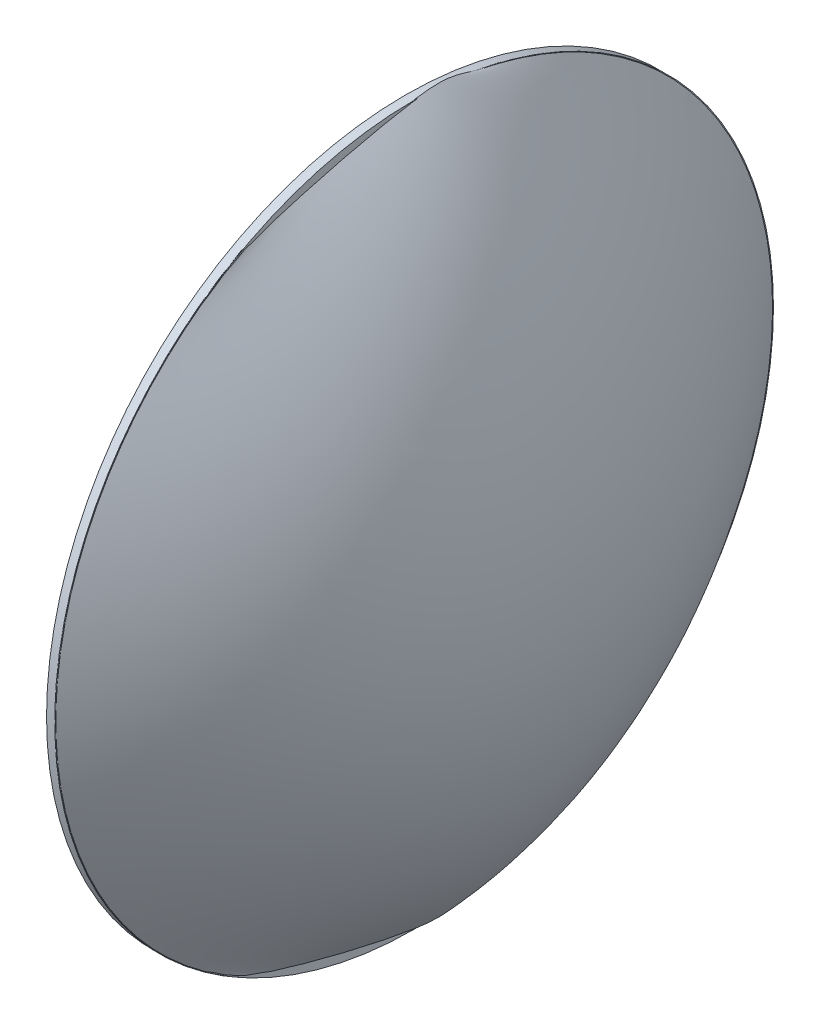
ISO-10303-21;
HEADER;
FILE_DESCRIPTION(('STEP AP214'),'2;1');
FILE_NAME('part.step','',(''),(''),'','','');
FILE_SCHEMA(('AUTOMOTIVE_DESIGN { 1 0 10303 214 1 1 1 1 }'));
ENDSEC;
DATA;
#1=APPLICATION_CONTEXT('core data for automotive mechanical design processes');
#2=APPLICATION_PROTOCOL_DEFINITION('international standard','automotive_design',2000,#1);
#3=PRODUCT_CONTEXT('',#1,'mechanical');
#4=PRODUCT('Part','Part','',(#3));
#5=PRODUCT_RELATED_PRODUCT_CATEGORY('part','',(#4));
#6=PRODUCT_DEFINITION_FORMATION('','',#4);
#7=PRODUCT_DEFINITION_CONTEXT('part definition',#1,'design');
#8=PRODUCT_DEFINITION('design','',#6,#7);
#9=PRODUCT_DEFINITION_SHAPE('','',#8);
#10=(LENGTH_UNIT() NAMED_UNIT(*) SI_UNIT(.MILLI.,.METRE.));
#11=(NAMED_UNIT(*) PLANE_ANGLE_UNIT() SI_UNIT($,.RADIAN.));
#12=(NAMED_UNIT(*) SI_UNIT($,.STERADIAN.) SOLID_ANGLE_UNIT());
#13=UNCERTAINTY_MEASURE_WITH_UNIT(LENGTH_MEASURE(1.E-05),#10,'distance_accuracy_value','');
#14=(GEOMETRIC_REPRESENTATION_CONTEXT(3) GLOBAL_UNCERTAINTY_ASSIGNED_CONTEXT((#13)) GLOBAL_UNIT_ASSIGNED_CONTEXT((#10,
#11,#12)) REPRESENTATION_CONTEXT('',''));
#15=CARTESIAN_POINT('',(0.,0.,0.));
#16=DIRECTION('',(0.,0.,1.));
#17=DIRECTION('',(1.,0.,0.));
#18=AXIS2_PLACEMENT_3D('',#15,#16,#17);
#19=CARTESIAN_POINT('',(5.05819278737862,12.3155775488069,-2.77582999720327));
#20=CARTESIAN_POINT('',(5.05819278737862,12.5513355717501,-2.03455000515564));
#21=CARTESIAN_POINT('',(5.05819278737863,12.8019065707928,-1.35369603384233));
#22=CARTESIAN_POINT('',(5.05819278737863,11.6556226490375,3.38241528943696));
#23=CARTESIAN_POINT('',(5.05819278737862,10.972008164738,5.34961794468563));
#24=CARTESIAN_POINT('',(5.05819278737862,12.1909921607769,-3.49372776593349));
#25=CARTESIAN_POINT('',(5.29928948159911,12.2749691544231,-2.52552998061758));
#26=CARTESIAN_POINT('',(5.56620600117032,12.2568156964552,-1.17109363359682));
#27=CARTESIAN_POINT('',(5.29928948159911,11.2783108464397,3.70213535397704));
#28=CARTESIAN_POINT('',(5.05819278737862,10.7047322717769,5.83936171325839));
#29=CARTESIAN_POINT('',(5.05819278737862,11.8156387321061,-4.9074715129215));
#30=CARTESIAN_POINT('',(5.78148287004008,11.5960536671584,-3.48543814106903));
#31=CARTESIAN_POINT('',(6.50429533061974,11.2045497443249,-0.805504169071557));
#32=CARTESIAN_POINT('',(5.78148287004008,10.4577633461603,4.30557097667063));
#33=CARTESIAN_POINT('',(5.05819278737862,10.1042565907709,6.78284474401733));
#34=CARTESIAN_POINT('',(5.05819278737862,10.5862056563845,-7.56246427816641));
#35=CARTESIAN_POINT('',(6.60933604258117,10.0006820747642,-5.27404460383994));
#36=CARTESIAN_POINT('',(8.18724550268375,9.04799376239242,-0.124849742357353));
#37=CARTESIAN_POINT('',(6.60933604258117,8.71716740829643,5.43135033005946));
#38=CARTESIAN_POINT('',(5.05819278737863,8.66321180992265,8.49343226643619));
#39=CARTESIAN_POINT('',(5.05819278737862,8.21350108134718,-10.4004550800361));
#40=CARTESIAN_POINT('',(7.43436932643087,7.49024081042976,-7.16442798617025));
#41=CARTESIAN_POINT('',(9.84050412670252,6.36953504309144,0.604701657512637));
#42=CARTESIAN_POINT('',(7.43436932643087,6.31907662708066,6.59556282796433));
#43=CARTESIAN_POINT('',(5.05819278737863,6.45598472635514,10.2402809457378));
#44=CARTESIAN_POINT('',(5.05819278737862,4.37109236655647,-12.6238337853541));
#45=CARTESIAN_POINT('',(8.0385807672631,3.90020346971298,-8.63321170518301));
#46=CARTESIAN_POINT('',(11.0596449752799,3.17403283196431,1.17551117067543));
#47=CARTESIAN_POINT('',(8.0385807672631,3.21746822656638,7.49013300950126));
#48=CARTESIAN_POINT('',(5.05819278737862,3.34718202182867,11.5609690567946));
#49=CARTESIAN_POINT('',(5.05819278737862,-0.000340070187399472,-13.3962527483643));
#50=CARTESIAN_POINT('',(8.24271338365613,-0.000340070187390755,-9.14142464673477));
#51=CARTESIAN_POINT('',(11.4697940350695,-0.000340070187372725,1.37396548187094));
#52=CARTESIAN_POINT('',(8.24271338365613,-0.000340070187372719,7.79727067207013));
#53=CARTESIAN_POINT('',(5.05819278737863,-0.000340070187374535,12.0118973447819));
#54=CARTESIAN_POINT('',(5.05819278737862,-4.37177250693124,-12.6238337853541));
#55=CARTESIAN_POINT('',(8.0385807672631,-3.90088361008774,-8.63321170518302));
#56=CARTESIAN_POINT('',(11.0596449752799,-3.17471297233906,1.17551117067543));
#57=CARTESIAN_POINT('',(8.03858076726311,-3.21814836694114,7.49013300950128));
#58=CARTESIAN_POINT('',(5.05819278737862,-3.34786216220344,11.5609690567946));
#59=CARTESIAN_POINT('',(5.05819278737862,-8.21418122172198,-10.400455080036));
#60=CARTESIAN_POINT('',(7.43436932643088,-7.49092095080453,-7.16442798617023));
#61=CARTESIAN_POINT('',(9.84050412670254,-6.37021518346619,0.604701657512632));
#62=CARTESIAN_POINT('',(7.43436932643088,-6.31975676745541,6.59556282796431));
#63=CARTESIAN_POINT('',(5.05819278737862,-6.45666486672991,10.2402809457378));
#64=CARTESIAN_POINT('',(5.05819278737862,-10.5868857967593,-7.56246427816644));
#65=CARTESIAN_POINT('',(6.60933604258117,-10.001362215139,-5.27404460383995));
#66=CARTESIAN_POINT('',(8.18724550268376,-9.0486739027672,-0.124849742357352));
#67=CARTESIAN_POINT('',(6.60933604258117,-8.71784754867119,5.43135033005949));
#68=CARTESIAN_POINT('',(5.05819278737863,-8.6638919502974,8.49343226643621));
#69=CARTESIAN_POINT('',(5.05819278737862,-11.8163188724809,-4.90747151292149));
#70=CARTESIAN_POINT('',(5.78148287004008,-11.5967338075332,-3.48543814106902));
#71=CARTESIAN_POINT('',(6.50429533061975,-11.2052298846996,-0.805504169071569));
#72=CARTESIAN_POINT('',(5.78148287004008,-10.4584434865351,4.30557097667065));
#73=CARTESIAN_POINT('',(5.05819278737862,-10.1049367311457,6.78284474401735));
#74=CARTESIAN_POINT('',(5.05819278737862,-12.1916723011517,-3.49372776593349));
#75=CARTESIAN_POINT('',(5.29928948159911,-12.2756492947979,-2.52552998061758));
#76=CARTESIAN_POINT('',(5.56620600117033,-12.25749583683,-1.17109363359683));
#77=CARTESIAN_POINT('',(5.29928948159911,-11.2789909868145,3.70213535397705));
#78=CARTESIAN_POINT('',(5.05819278737862,-10.7054124121517,5.8393617132584));
#79=CARTESIAN_POINT('',(5.05819278737862,-12.3162576891817,-2.77582999720327));
#80=CARTESIAN_POINT('',(5.05819278737863,-12.5520157121249,-2.03455000515564));
#81=CARTESIAN_POINT('',(5.05819278737864,-12.8025867111676,-1.35369603384233));
#82=CARTESIAN_POINT('',(5.05819278737863,-11.6563027894123,3.38241528943697));
#83=CARTESIAN_POINT('',(5.05819278737862,-10.9726883051127,5.34961794468564));
#84=B_SPLINE_SURFACE_WITH_KNOTS('',3,3,((#19,#20,#21,#22,#23),(#24,#25,#26,#27,#28),(#29,#30,
#31,#32,#33),(#34,#35,#36,#37,#38),(#39,#40,#41,#42,#43),(#44,#45,#46,#47,#48),(#49,#50,#51,#52,
#53),(#54,#55,#56,#57,#58),(#59,#60,#61,#62,#63),(#64,#65,#66,#67,#68),(#69,#70,#71,#72,#73),
(#74,#75,#76,#77,#78),(#79,#80,#81,#82,#83)),.UNSPECIFIED.,.F.,.F.,.F.,(4,1,1,1,1,1,1,1,1,1,4),
(4,1,4),(0.,0.0625,0.125,0.25,0.375,0.5,0.625,0.75,0.875,0.9375,1.),(0.,0.442388494157825,1.),.UNSPECIFIED.);
#85=CARTESIAN_POINT('',(5.05819278737862,12.3155775488069,-2.77582999720327));
#86=CARTESIAN_POINT('',(5.05819278737862,12.1909921607769,-3.49372776593349));
#87=CARTESIAN_POINT('',(5.05819278737862,11.8156387321061,-4.9074715129215));
#88=CARTESIAN_POINT('',(5.05819278737862,10.5862056563845,-7.56246427816641));
#89=CARTESIAN_POINT('',(5.05819278737862,8.21350108134718,-10.4004550800361));
#90=CARTESIAN_POINT('',(5.05819278737862,4.37109236655647,-12.6238337853541));
#91=CARTESIAN_POINT('',(5.05819278737862,-0.000340070187399472,-13.3962527483643));
#92=CARTESIAN_POINT('',(5.05819278737862,-4.37177250693124,-12.6238337853541));
#93=CARTESIAN_POINT('',(5.05819278737862,-8.21418122172198,-10.400455080036));
#94=CARTESIAN_POINT('',(5.05819278737862,-10.5868857967593,-7.56246427816644));
#95=CARTESIAN_POINT('',(5.05819278737862,-11.8163188724809,-4.90747151292149));
#96=CARTESIAN_POINT('',(5.05819278737862,-12.1916723011517,-3.49372776593349));
#97=CARTESIAN_POINT('',(5.05819278737862,-12.3162576891817,-2.77582999720327));
#98=B_SPLINE_CURVE_WITH_KNOTS('',3,(#85,#86,#87,#88,#89,#90,#91,#92,#93,#94,#95,#96,#97),
.UNSPECIFIED.,.F.,.F.,(4,1,1,1,1,1,1,1,1,1,4),(0.,0.0625,0.125,0.25,0.375,0.5,0.625,0.75,0.875,
0.9375,1.),.UNSPECIFIED.);
#99=CARTESIAN_POINT('',(5.05819278737862,12.3155775488069,-2.77582999720327));
#100=VERTEX_POINT('',#99);
#101=CARTESIAN_POINT('',(5.05819278737862,-12.3162576891817,-2.77582999720327));
#102=VERTEX_POINT('',#101);
#103=EDGE_CURVE('E14',#100,#102,#98,.T.);
#104=CARTESIAN_POINT('',(5.05819278737862,-12.3162576891817,-2.77582999720327));
#105=CARTESIAN_POINT('',(5.05819278737863,-12.5520157121249,-2.03455000515564));
#106=CARTESIAN_POINT('',(5.05819278737864,-12.8025867111676,-1.35369603384233));
#107=CARTESIAN_POINT('',(5.05819278737863,-11.6563027894123,3.38241528943697));
#108=CARTESIAN_POINT('',(5.05819278737862,-10.9726883051127,5.34961794468564));
#109=B_SPLINE_CURVE_WITH_KNOTS('',3,(#104,#105,#106,#107,#108),.UNSPECIFIED.,.F.,.F.,(4,1,4),
(0.,0.442388494157825,1.),.UNSPECIFIED.);
#110=CARTESIAN_POINT('',(5.05819278737862,-10.9726883051127,5.34961794468564));
#111=VERTEX_POINT('',#110);
#112=EDGE_CURVE('E83',#102,#111,#109,.T.);
#113=CARTESIAN_POINT('',(5.05819278737862,10.972008164738,5.34961794468563));
#114=CARTESIAN_POINT('',(5.05819278737862,10.7047322717769,5.83936171325839));
#115=CARTESIAN_POINT('',(5.05819278737862,10.1042565907709,6.78284474401733));
#116=CARTESIAN_POINT('',(5.05819278737863,8.66321180992265,8.49343226643619));
#117=CARTESIAN_POINT('',(5.05819278737863,6.45598472635514,10.2402809457378));
#118=CARTESIAN_POINT('',(5.05819278737862,3.34718202182867,11.5609690567946));
#119=CARTESIAN_POINT('',(5.05819278737863,-0.000340070187374535,12.0118973447819));
#120=CARTESIAN_POINT('',(5.05819278737862,-3.34786216220344,11.5609690567946));
#121=CARTESIAN_POINT('',(5.05819278737862,-6.45666486672991,10.2402809457378));
#122=CARTESIAN_POINT('',(5.05819278737863,-8.6638919502974,8.49343226643621));
#123=CARTESIAN_POINT('',(5.05819278737862,-10.1049367311457,6.78284474401735));
#124=CARTESIAN_POINT('',(5.05819278737862,-10.7054124121517,5.8393617132584));
#125=CARTESIAN_POINT('',(5.05819278737862,-10.9726883051127,5.34961794468564));
#126=B_SPLINE_CURVE_WITH_KNOTS('',3,(#113,#114,#115,#116,#117,#118,#119,#120,#121,#122,#123,
#124,#125),.UNSPECIFIED.,.F.,.F.,(4,1,1,1,1,1,1,1,1,1,4),(0.,0.0625,0.125,0.25,0.375,0.5,0.625,
0.75,0.875,0.9375,1.),.UNSPECIFIED.);
#127=CARTESIAN_POINT('',(5.05819278737862,10.972008164738,5.34961794468563));
#128=VERTEX_POINT('',#127);
#129=EDGE_CURVE('E99',#111,#128,#126,.F.);
#130=CARTESIAN_POINT('',(5.05819278737862,12.3155775488069,-2.77582999720327));
#131=CARTESIAN_POINT('',(5.05819278737862,12.5513355717501,-2.03455000515564));
#132=CARTESIAN_POINT('',(5.05819278737863,12.8019065707928,-1.35369603384233));
#133=CARTESIAN_POINT('',(5.05819278737863,11.6556226490375,3.38241528943696));
#134=CARTESIAN_POINT('',(5.05819278737862,10.972008164738,5.34961794468563));
#135=B_SPLINE_CURVE_WITH_KNOTS('',3,(#130,#131,#132,#133,#134),.UNSPECIFIED.,.F.,.F.,(4,1,4),
(0.,0.442388494157825,1.),.UNSPECIFIED.);
#136=EDGE_CURVE('E103',#128,#100,#135,.F.);
#137=ORIENTED_EDGE('',*,*,#103,.T.);
#138=ORIENTED_EDGE('',*,*,#112,.T.);
#139=ORIENTED_EDGE('',*,*,#129,.T.);
#140=ORIENTED_EDGE('',*,*,#136,.T.);
#141=EDGE_LOOP('',(#137,#138,#139,#140));
#142=FACE_BOUND('',#141,.T.);
#143=ADVANCED_FACE('F80',(#142),#84,.T.);
#144=OPEN_SHELL('',(#143));
#145=SHELL_BASED_SURFACE_MODEL('B2',(#144));
#146=CARTESIAN_POINT('',(5.07360834674977,0.,-0.649890601008446));
#147=DIRECTION('',(-1.,0.,0.));
#148=DIRECTION('',(0.,0.,1.));
#149=AXIS2_PLACEMENT_3D('',#146,#147,#148);
#150=CYLINDRICAL_SURFACE('',#149,12.5);
#151=CARTESIAN_POINT('',(5.07360834674977,0.,-0.649890601008446));
#152=DIRECTION('',(1.,0.,0.));
#153=DIRECTION('',(0.,0.,-1.));
#154=AXIS2_PLACEMENT_3D('',#151,#152,#153);
#155=CIRCLE('',#154,12.5);
#156=CARTESIAN_POINT('',(5.07360834674977,0.,-13.1498906010084));
#157=VERTEX_POINT('',#156);
#158=EDGE_CURVE('E79',#157,#157,#155,.T.);
#159=ORIENTED_EDGE('',*,*,#158,.F.);
#160=EDGE_LOOP('',(#159));
#161=FACE_BOUND('',#160,.T.);
#162=CARTESIAN_POINT('',(4.76110834674977,0.,-0.649890601008446));
#163=DIRECTION('',(1.,0.,0.));
#164=DIRECTION('',(0.,0.,-1.));
#165=AXIS2_PLACEMENT_3D('',#162,#163,#164);
#166=CIRCLE('',#165,12.5);
#167=CARTESIAN_POINT('',(4.76110834674977,0.,-13.1498906010084));
#168=VERTEX_POINT('',#167);
#169=EDGE_CURVE('E159',#168,#168,#166,.T.);
#170=ORIENTED_EDGE('',*,*,#169,.T.);
#171=EDGE_LOOP('',(#170));
#172=FACE_BOUND('',#171,.T.);
#173=ADVANCED_FACE('F156',(#161,#172),#150,.T.);
#174=CARTESIAN_POINT('',(5.07360834674977,0.,-0.649890601008446));
#175=DIRECTION('',(1.,0.,0.));
#176=DIRECTION('',(0.,0.,-1.));
#177=AXIS2_PLACEMENT_3D('',#174,#175,#176);
#178=PLANE('',#177);
#179=ORIENTED_EDGE('',*,*,#158,.T.);
#180=EDGE_LOOP('',(#179));
#181=FACE_BOUND('',#180,.T.);
#182=ADVANCED_FACE('F173',(#181),#178,.T.);
#183=CARTESIAN_POINT('',(4.76110834674977,0.,-0.649890601008446));
#184=DIRECTION('',(1.,0.,0.));
#185=DIRECTION('',(0.,0.,-1.));
#186=AXIS2_PLACEMENT_3D('',#183,#184,#185);
#187=PLANE('',#186);
#188=ORIENTED_EDGE('',*,*,#169,.F.);
#189=EDGE_LOOP('',(#188));
#190=FACE_BOUND('',#189,.T.);
#191=ADVANCED_FACE('F171',(#190),#187,.F.);
#192=CLOSED_SHELL('',(#173,#182,#191));
#193=MANIFOLD_SOLID_BREP('B8',#192);
#194=ADVANCED_BREP_SHAPE_REPRESENTATION('',(#18,#193),#14);
#195=MANIFOLD_SURFACE_SHAPE_REPRESENTATION('',(#18,#145),#14);
#196=SHAPE_REPRESENTATION('',(#18),#14);
#197=SHAPE_DEFINITION_REPRESENTATION(#9,#196);
#198=SHAPE_REPRESENTATION_RELATIONSHIP('','',#196,#194);
#199=SHAPE_REPRESENTATION_RELATIONSHIP('','',#196,#195);
ENDSEC;
END-ISO-10303-21;
